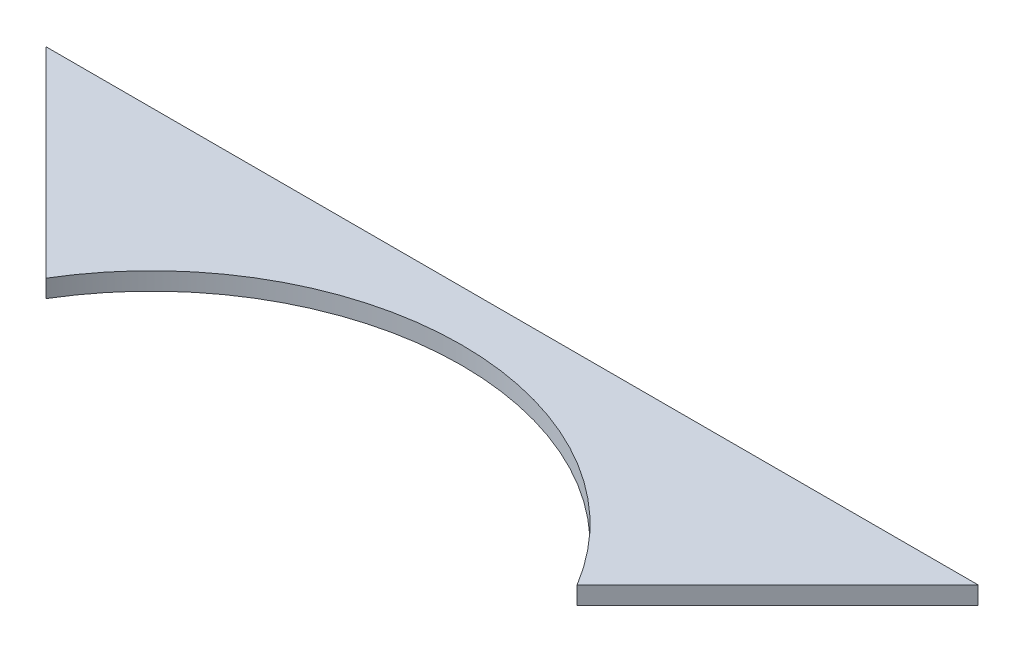
ISO-10303-21;
HEADER;
FILE_DESCRIPTION(('STEP AP214'),'2;1');
FILE_NAME('part.step','',(''),(''),'','','');
FILE_SCHEMA(('AUTOMOTIVE_DESIGN { 1 0 10303 214 1 1 1 1 }'));
ENDSEC;
DATA;
#1=APPLICATION_CONTEXT('core data for automotive mechanical design processes');
#2=APPLICATION_PROTOCOL_DEFINITION('international standard','automotive_design',2000,#1);
#3=PRODUCT_CONTEXT('',#1,'mechanical');
#4=PRODUCT('Part','Part','',(#3));
#5=PRODUCT_RELATED_PRODUCT_CATEGORY('part','',(#4));
#6=PRODUCT_DEFINITION_FORMATION('','',#4);
#7=PRODUCT_DEFINITION_CONTEXT('part definition',#1,'design');
#8=PRODUCT_DEFINITION('design','',#6,#7);
#9=PRODUCT_DEFINITION_SHAPE('','',#8);
#10=(LENGTH_UNIT() NAMED_UNIT(*) SI_UNIT(.MILLI.,.METRE.));
#11=(NAMED_UNIT(*) PLANE_ANGLE_UNIT() SI_UNIT($,.RADIAN.));
#12=(NAMED_UNIT(*) SI_UNIT($,.STERADIAN.) SOLID_ANGLE_UNIT());
#13=UNCERTAINTY_MEASURE_WITH_UNIT(LENGTH_MEASURE(1.E-05),#10,'distance_accuracy_value','');
#14=(GEOMETRIC_REPRESENTATION_CONTEXT(3) GLOBAL_UNCERTAINTY_ASSIGNED_CONTEXT((#13)) GLOBAL_UNIT_ASSIGNED_CONTEXT((#10,
#11,#12)) REPRESENTATION_CONTEXT('',''));
#15=CARTESIAN_POINT('',(0.,0.,0.));
#16=DIRECTION('',(0.,0.,1.));
#17=DIRECTION('',(1.,0.,0.));
#18=AXIS2_PLACEMENT_3D('',#15,#16,#17);
#19=CARTESIAN_POINT('',(0.,0.,31.1381282925026));
#20=DIRECTION('',(0.,-1.,0.));
#21=DIRECTION('',(0.,0.,-1.));
#22=AXIS2_PLACEMENT_3D('',#19,#20,#21);
#23=PLANE('',#22);
#24=DIRECTION('',(-0.707106781186551,0.,0.707106781186544));
#25=VECTOR('',#24,1.);
#26=CARTESIAN_POINT('',(26.305,0.,10.7960656172801));
#27=LINE('',#26,#25);
#28=CARTESIAN_POINT('',(26.305,0.,10.7960656172801));
#29=VERTEX_POINT('',#28);
#30=CARTESIAN_POINT('',(14.9912915010152,0.,22.1097741162648));
#31=VERTEX_POINT('',#30);
#32=EDGE_CURVE('E70',#29,#31,#27,.T.);
#33=ORIENTED_EDGE('',*,*,#32,.T.);
#34=CARTESIAN_POINT('',(0.,0.,31.1381282925026));
#35=DIRECTION('',(0.,-1.,0.));
#36=DIRECTION('',(0.,0.,-1.));
#37=AXIS2_PLACEMENT_3D('',#34,#35,#36);
#38=CIRCLE('',#37,17.5);
#39=CARTESIAN_POINT('',(-14.9912915010152,0.,22.1097741162648));
#40=VERTEX_POINT('',#39);
#41=EDGE_CURVE('E20',#31,#40,#38,.F.);
#42=ORIENTED_EDGE('',*,*,#41,.T.);
#43=DIRECTION('',(-0.707106781186551,0.,-0.707106781186544));
#44=VECTOR('',#43,1.);
#45=CARTESIAN_POINT('',(-14.9912915010152,0.,22.1097741162648));
#46=LINE('',#45,#44);
#47=CARTESIAN_POINT('',(-26.305,0.,10.7960656172801));
#48=VERTEX_POINT('',#47);
#49=EDGE_CURVE('E83',#40,#48,#46,.T.);
#50=ORIENTED_EDGE('',*,*,#49,.T.);
#51=DIRECTION('',(1.,0.,0.));
#52=VECTOR('',#51,1.);
#53=CARTESIAN_POINT('',(-26.305,0.,10.7960656172801));
#54=LINE('',#53,#52);
#55=EDGE_CURVE('E57',#48,#29,#54,.T.);
#56=ORIENTED_EDGE('',*,*,#55,.T.);
#57=EDGE_LOOP('',(#33,#42,#50,#56));
#58=FACE_BOUND('',#57,.T.);
#59=ADVANCED_FACE('F17',(#58),#23,.T.);
#60=CARTESIAN_POINT('',(-26.305,1.,10.7960656172801));
#61=DIRECTION('',(0.,0.,1.));
#62=DIRECTION('',(1.,0.,0.));
#63=AXIS2_PLACEMENT_3D('',#60,#61,#62);
#64=PLANE('',#63);
#65=DIRECTION('',(0.,1.,0.));
#66=VECTOR('',#65,1.);
#67=CARTESIAN_POINT('',(-26.305,1.,10.7960656172801));
#68=LINE('',#67,#66);
#69=CARTESIAN_POINT('',(-26.305,1.,10.7960656172801));
#70=VERTEX_POINT('',#69);
#71=EDGE_CURVE('E81',#48,#70,#68,.T.);
#72=ORIENTED_EDGE('',*,*,#71,.T.);
#73=DIRECTION('',(1.,0.,0.));
#74=VECTOR('',#73,1.);
#75=CARTESIAN_POINT('',(0.,1.,10.7960656172801));
#76=LINE('',#75,#74);
#77=CARTESIAN_POINT('',(26.305,1.,10.7960656172801));
#78=VERTEX_POINT('',#77);
#79=EDGE_CURVE('E77',#70,#78,#76,.T.);
#80=ORIENTED_EDGE('',*,*,#79,.T.);
#81=DIRECTION('',(0.,1.,0.));
#82=VECTOR('',#81,1.);
#83=CARTESIAN_POINT('',(26.305,1.,10.7960656172801));
#84=LINE('',#83,#82);
#85=EDGE_CURVE('E65',#78,#29,#84,.F.);
#86=ORIENTED_EDGE('',*,*,#85,.T.);
#87=ORIENTED_EDGE('',*,*,#55,.F.);
#88=EDGE_LOOP('',(#72,#80,#86,#87));
#89=FACE_BOUND('',#88,.T.);
#90=ADVANCED_FACE('F80',(#89),#64,.F.);
#91=CARTESIAN_POINT('',(26.305,1.,10.7960656172801));
#92=DIRECTION('',(-0.707106781186544,0.,-0.707106781186551));
#93=DIRECTION('',(-0.707106781186551,0.,0.707106781186544));
#94=AXIS2_PLACEMENT_3D('',#91,#92,#93);
#95=PLANE('',#94);
#96=ORIENTED_EDGE('',*,*,#85,.F.);
#97=DIRECTION('',(-0.707106781186551,0.,0.707106781186544));
#98=VECTOR('',#97,1.);
#99=CARTESIAN_POINT('',(26.305,1.,10.7960656172801));
#100=LINE('',#99,#98);
#101=CARTESIAN_POINT('',(14.9912915010152,1.,22.1097741162648));
#102=VERTEX_POINT('',#101);
#103=EDGE_CURVE('E69',#78,#102,#100,.T.);
#104=ORIENTED_EDGE('',*,*,#103,.T.);
#105=DIRECTION('',(0.,-1.,0.));
#106=VECTOR('',#105,1.);
#107=CARTESIAN_POINT('',(14.9912915010152,1.,22.1097741162648));
#108=LINE('',#107,#106);
#109=EDGE_CURVE('E95',#102,#31,#108,.T.);
#110=ORIENTED_EDGE('',*,*,#109,.T.);
#111=ORIENTED_EDGE('',*,*,#32,.F.);
#112=EDGE_LOOP('',(#96,#104,#110,#111));
#113=FACE_BOUND('',#112,.T.);
#114=ADVANCED_FACE('F67',(#113),#95,.F.);
#115=CARTESIAN_POINT('',(0.,1.,31.1381282925026));
#116=DIRECTION('',(0.,-1.,0.));
#117=DIRECTION('',(0.,0.,-1.));
#118=AXIS2_PLACEMENT_3D('',#115,#116,#117);
#119=CYLINDRICAL_SURFACE('',#118,17.5);
#120=CARTESIAN_POINT('',(0.,1.,31.1381282925026));
#121=DIRECTION('',(0.,-1.,0.));
#122=DIRECTION('',(0.,0.,-1.));
#123=AXIS2_PLACEMENT_3D('',#120,#121,#122);
#124=CIRCLE('',#123,17.5);
#125=CARTESIAN_POINT('',(-14.9912915010152,1.,22.1097741162648));
#126=VERTEX_POINT('',#125);
#127=EDGE_CURVE('E27',#102,#126,#124,.F.);
#128=ORIENTED_EDGE('',*,*,#127,.T.);
#129=DIRECTION('',(0.,1.,0.));
#130=VECTOR('',#129,1.);
#131=CARTESIAN_POINT('',(-14.9912915010152,1.,22.1097741162648));
#132=LINE('',#131,#130);
#133=EDGE_CURVE('E87',#126,#40,#132,.F.);
#134=ORIENTED_EDGE('',*,*,#133,.T.);
#135=ORIENTED_EDGE('',*,*,#41,.F.);
#136=ORIENTED_EDGE('',*,*,#109,.F.);
#137=EDGE_LOOP('',(#128,#134,#135,#136));
#138=FACE_BOUND('',#137,.T.);
#139=ADVANCED_FACE('F112',(#138),#119,.F.);
#140=CARTESIAN_POINT('',(-14.9912915010152,1.,22.1097741162648));
#141=DIRECTION('',(0.707106781186544,0.,-0.707106781186551));
#142=DIRECTION('',(-0.707106781186551,0.,-0.707106781186544));
#143=AXIS2_PLACEMENT_3D('',#140,#141,#142);
#144=PLANE('',#143);
#145=ORIENTED_EDGE('',*,*,#133,.F.);
#146=DIRECTION('',(-0.707106781186551,0.,-0.707106781186544));
#147=VECTOR('',#146,1.);
#148=CARTESIAN_POINT('',(-14.9912915010152,1.,22.1097741162648));
#149=LINE('',#148,#147);
#150=EDGE_CURVE('E11',#126,#70,#149,.T.);
#151=ORIENTED_EDGE('',*,*,#150,.T.);
#152=ORIENTED_EDGE('',*,*,#71,.F.);
#153=ORIENTED_EDGE('',*,*,#49,.F.);
#154=EDGE_LOOP('',(#145,#151,#152,#153));
#155=FACE_BOUND('',#154,.T.);
#156=ADVANCED_FACE('F114',(#155),#144,.F.);
#157=CARTESIAN_POINT('',(0.,1.,31.1381282925026));
#158=DIRECTION('',(0.,-1.,0.));
#159=DIRECTION('',(0.,0.,-1.));
#160=AXIS2_PLACEMENT_3D('',#157,#158,#159);
#161=PLANE('',#160);
#162=ORIENTED_EDGE('',*,*,#150,.F.);
#163=ORIENTED_EDGE('',*,*,#127,.F.);
#164=ORIENTED_EDGE('',*,*,#103,.F.);
#165=ORIENTED_EDGE('',*,*,#79,.F.);
#166=EDGE_LOOP('',(#162,#163,#164,#165));
#167=FACE_BOUND('',#166,.T.);
#168=ADVANCED_FACE('F76',(#167),#161,.F.);
#169=CLOSED_SHELL('',(#59,#90,#114,#139,#156,#168));
#170=MANIFOLD_SOLID_BREP('B1',#169);
#171=ADVANCED_BREP_SHAPE_REPRESENTATION('',(#18,#170),#14);
#172=SHAPE_DEFINITION_REPRESENTATION(#9,#171);
ENDSEC;
END-ISO-10303-21;
